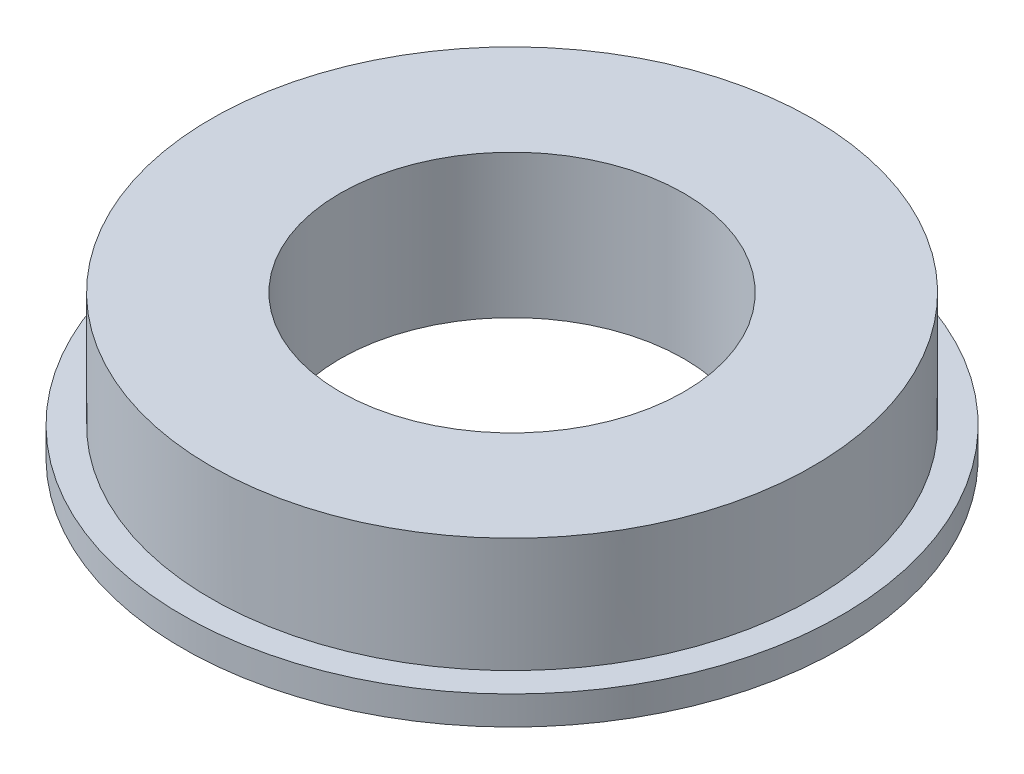
ISO-10303-21;
HEADER;
FILE_DESCRIPTION(('STEP AP214'),'2;1');
FILE_NAME('part.step','',(''),(''),'','','');
FILE_SCHEMA(('AUTOMOTIVE_DESIGN { 1 0 10303 214 1 1 1 1 }'));
ENDSEC;
DATA;
#1=APPLICATION_CONTEXT('core data for automotive mechanical design processes');
#2=APPLICATION_PROTOCOL_DEFINITION('international standard','automotive_design',2000,#1);
#3=PRODUCT_CONTEXT('',#1,'mechanical');
#4=PRODUCT('Part','Part','',(#3));
#5=PRODUCT_RELATED_PRODUCT_CATEGORY('part','',(#4));
#6=PRODUCT_DEFINITION_FORMATION('','',#4);
#7=PRODUCT_DEFINITION_CONTEXT('part definition',#1,'design');
#8=PRODUCT_DEFINITION('design','',#6,#7);
#9=PRODUCT_DEFINITION_SHAPE('','',#8);
#10=(LENGTH_UNIT() NAMED_UNIT(*) SI_UNIT(.MILLI.,.METRE.));
#11=(NAMED_UNIT(*) PLANE_ANGLE_UNIT() SI_UNIT($,.RADIAN.));
#12=(NAMED_UNIT(*) SI_UNIT($,.STERADIAN.) SOLID_ANGLE_UNIT());
#13=UNCERTAINTY_MEASURE_WITH_UNIT(LENGTH_MEASURE(1.E-05),#10,'distance_accuracy_value','');
#14=(GEOMETRIC_REPRESENTATION_CONTEXT(3) GLOBAL_UNCERTAINTY_ASSIGNED_CONTEXT((#13)) GLOBAL_UNIT_ASSIGNED_CONTEXT((#10,
#11,#12)) REPRESENTATION_CONTEXT('',''));
#15=CARTESIAN_POINT('',(0.,0.,0.));
#16=DIRECTION('',(0.,0.,1.));
#17=DIRECTION('',(1.,0.,0.));
#18=AXIS2_PLACEMENT_3D('',#15,#16,#17);
#19=CARTESIAN_POINT('',(0.,5.,0.));
#20=DIRECTION('',(0.,-1.,0.));
#21=DIRECTION('',(0.,0.,-1.));
#22=AXIS2_PLACEMENT_3D('',#19,#20,#21);
#23=CYLINDRICAL_SURFACE('',#22,10.5);
#24=CARTESIAN_POINT('',(0.,5.,0.));
#25=DIRECTION('',(0.,1.,0.));
#26=DIRECTION('',(0.,0.,1.));
#27=AXIS2_PLACEMENT_3D('',#24,#25,#26);
#28=CIRCLE('',#27,10.5);
#29=CARTESIAN_POINT('',(0.,5.,10.5));
#30=VERTEX_POINT('',#29);
#31=EDGE_CURVE('E42',#30,#30,#28,.T.);
#32=ORIENTED_EDGE('',*,*,#31,.F.);
#33=EDGE_LOOP('',(#32));
#34=FACE_BOUND('',#33,.T.);
#35=CARTESIAN_POINT('',(0.,1.,0.));
#36=DIRECTION('',(0.,-1.,0.));
#37=DIRECTION('',(0.,0.,-1.));
#38=AXIS2_PLACEMENT_3D('',#35,#36,#37);
#39=CIRCLE('',#38,10.5);
#40=CARTESIAN_POINT('',(0.,1.,-10.5));
#41=VERTEX_POINT('',#40);
#42=EDGE_CURVE('E10',#41,#41,#39,.T.);
#43=ORIENTED_EDGE('',*,*,#42,.F.);
#44=EDGE_LOOP('',(#43));
#45=FACE_BOUND('',#44,.T.);
#46=ADVANCED_FACE('F36',(#34,#45),#23,.T.);
#47=CARTESIAN_POINT('',(0.,5.,0.));
#48=DIRECTION('',(0.,1.,0.));
#49=DIRECTION('',(0.,0.,1.));
#50=AXIS2_PLACEMENT_3D('',#47,#48,#49);
#51=PLANE('',#50);
#52=ORIENTED_EDGE('',*,*,#31,.T.);
#53=EDGE_LOOP('',(#52));
#54=FACE_BOUND('',#53,.T.);
#55=CARTESIAN_POINT('',(0.,5.,0.));
#56=DIRECTION('',(0.,1.,0.));
#57=DIRECTION('',(0.,0.,1.));
#58=AXIS2_PLACEMENT_3D('',#55,#56,#57);
#59=CIRCLE('',#58,6.);
#60=CARTESIAN_POINT('',(0.,5.,6.));
#61=VERTEX_POINT('',#60);
#62=EDGE_CURVE('E46',#61,#61,#59,.T.);
#63=ORIENTED_EDGE('',*,*,#62,.F.);
#64=EDGE_LOOP('',(#63));
#65=FACE_BOUND('',#64,.T.);
#66=ADVANCED_FACE('F74',(#54,#65),#51,.T.);
#67=CARTESIAN_POINT('',(0.,0.,0.));
#68=DIRECTION('',(0.,1.,0.));
#69=DIRECTION('',(0.,0.,1.));
#70=AXIS2_PLACEMENT_3D('',#67,#68,#69);
#71=PLANE('',#70);
#72=CARTESIAN_POINT('',(0.,0.,0.));
#73=DIRECTION('',(0.,1.,0.));
#74=DIRECTION('',(0.,0.,1.));
#75=AXIS2_PLACEMENT_3D('',#72,#73,#74);
#76=CIRCLE('',#75,6.);
#77=CARTESIAN_POINT('',(0.,0.,6.));
#78=VERTEX_POINT('',#77);
#79=EDGE_CURVE('E50',#78,#78,#76,.T.);
#80=ORIENTED_EDGE('',*,*,#79,.T.);
#81=EDGE_LOOP('',(#80));
#82=FACE_BOUND('',#81,.T.);
#83=CARTESIAN_POINT('',(0.,0.,0.));
#84=DIRECTION('',(0.,-1.,0.));
#85=DIRECTION('',(0.,0.,-1.));
#86=AXIS2_PLACEMENT_3D('',#83,#84,#85);
#87=CIRCLE('',#86,11.5);
#88=CARTESIAN_POINT('',(0.,0.,-11.5));
#89=VERTEX_POINT('',#88);
#90=EDGE_CURVE('E56',#89,#89,#87,.T.);
#91=ORIENTED_EDGE('',*,*,#90,.T.);
#92=EDGE_LOOP('',(#91));
#93=FACE_BOUND('',#92,.T.);
#94=ADVANCED_FACE('F79',(#82,#93),#71,.F.);
#95=CARTESIAN_POINT('',(0.,5.,0.));
#96=DIRECTION('',(0.,-1.,0.));
#97=DIRECTION('',(0.,0.,-1.));
#98=AXIS2_PLACEMENT_3D('',#95,#96,#97);
#99=CYLINDRICAL_SURFACE('',#98,6.);
#100=ORIENTED_EDGE('',*,*,#62,.T.);
#101=EDGE_LOOP('',(#100));
#102=FACE_BOUND('',#101,.T.);
#103=ORIENTED_EDGE('',*,*,#79,.F.);
#104=EDGE_LOOP('',(#103));
#105=FACE_BOUND('',#104,.T.);
#106=ADVANCED_FACE('F71',(#102,#105),#99,.F.);
#107=CARTESIAN_POINT('',(0.,1.,0.));
#108=DIRECTION('',(0.,-1.,0.));
#109=DIRECTION('',(0.,0.,-1.));
#110=AXIS2_PLACEMENT_3D('',#107,#108,#109);
#111=CYLINDRICAL_SURFACE('',#110,11.5);
#112=CARTESIAN_POINT('',(0.,1.,0.));
#113=DIRECTION('',(0.,-1.,0.));
#114=DIRECTION('',(0.,0.,-1.));
#115=AXIS2_PLACEMENT_3D('',#112,#113,#114);
#116=CIRCLE('',#115,11.5);
#117=CARTESIAN_POINT('',(0.,1.,-11.5));
#118=VERTEX_POINT('',#117);
#119=EDGE_CURVE('E54',#118,#118,#116,.T.);
#120=ORIENTED_EDGE('',*,*,#119,.T.);
#121=EDGE_LOOP('',(#120));
#122=FACE_BOUND('',#121,.T.);
#123=ORIENTED_EDGE('',*,*,#90,.F.);
#124=EDGE_LOOP('',(#123));
#125=FACE_BOUND('',#124,.T.);
#126=ADVANCED_FACE('F62',(#122,#125),#111,.T.);
#127=CARTESIAN_POINT('',(0.,1.,0.));
#128=DIRECTION('',(0.,-1.,0.));
#129=DIRECTION('',(0.,0.,-1.));
#130=AXIS2_PLACEMENT_3D('',#127,#128,#129);
#131=PLANE('',#130);
#132=ORIENTED_EDGE('',*,*,#42,.T.);
#133=EDGE_LOOP('',(#132));
#134=FACE_BOUND('',#133,.T.);
#135=ORIENTED_EDGE('',*,*,#119,.F.);
#136=EDGE_LOOP('',(#135));
#137=FACE_BOUND('',#136,.T.);
#138=ADVANCED_FACE('F65',(#134,#137),#131,.F.);
#139=CLOSED_SHELL('',(#46,#66,#94,#106,#126,#138));
#140=MANIFOLD_SOLID_BREP('B2',#139);
#141=ADVANCED_BREP_SHAPE_REPRESENTATION('',(#18,#140),#14);
#142=SHAPE_DEFINITION_REPRESENTATION(#9,#141);
ENDSEC;
END-ISO-10303-21;
